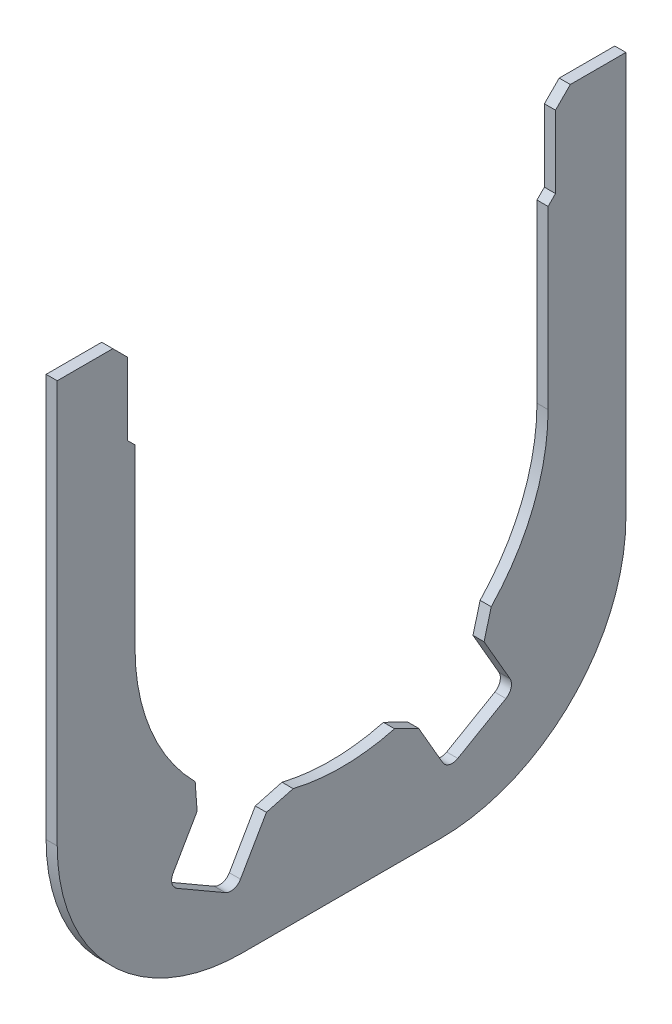
ISO-10303-21;
HEADER;
FILE_DESCRIPTION(('STEP AP214'),'2;1');
FILE_NAME('part.step','',(''),(''),'','','');
FILE_SCHEMA(('AUTOMOTIVE_DESIGN { 1 0 10303 214 1 1 1 1 }'));
ENDSEC;
DATA;
#1=APPLICATION_CONTEXT('core data for automotive mechanical design processes');
#2=APPLICATION_PROTOCOL_DEFINITION('international standard','automotive_design',2000,#1);
#3=PRODUCT_CONTEXT('',#1,'mechanical');
#4=PRODUCT('Part','Part','',(#3));
#5=PRODUCT_RELATED_PRODUCT_CATEGORY('part','',(#4));
#6=PRODUCT_DEFINITION_FORMATION('','',#4);
#7=PRODUCT_DEFINITION_CONTEXT('part definition',#1,'design');
#8=PRODUCT_DEFINITION('design','',#6,#7);
#9=PRODUCT_DEFINITION_SHAPE('','',#8);
#10=(LENGTH_UNIT() NAMED_UNIT(*) SI_UNIT(.MILLI.,.METRE.));
#11=(NAMED_UNIT(*) PLANE_ANGLE_UNIT() SI_UNIT($,.RADIAN.));
#12=(NAMED_UNIT(*) SI_UNIT($,.STERADIAN.) SOLID_ANGLE_UNIT());
#13=UNCERTAINTY_MEASURE_WITH_UNIT(LENGTH_MEASURE(1.E-05),#10,'distance_accuracy_value','');
#14=(GEOMETRIC_REPRESENTATION_CONTEXT(3) GLOBAL_UNCERTAINTY_ASSIGNED_CONTEXT((#13)) GLOBAL_UNIT_ASSIGNED_CONTEXT((#10,
#11,#12)) REPRESENTATION_CONTEXT('',''));
#15=CARTESIAN_POINT('',(0.,0.,0.));
#16=DIRECTION('',(0.,0.,1.));
#17=DIRECTION('',(1.,0.,0.));
#18=AXIS2_PLACEMENT_3D('',#15,#16,#17);
#19=CARTESIAN_POINT('',(-3.,0.,0.));
#20=DIRECTION('',(1.,0.,0.));
#21=DIRECTION('',(0.,0.,-1.));
#22=AXIS2_PLACEMENT_3D('',#19,#20,#21);
#23=CYLINDRICAL_SURFACE('',#22,111.5);
#24=CARTESIAN_POINT('',(3.,0.,0.));
#25=DIRECTION('',(-1.,0.,0.));
#26=DIRECTION('',(0.,0.,-1.));
#27=AXIS2_PLACEMENT_3D('',#24,#25,#26);
#28=CIRCLE('',#27,111.5);
#29=CARTESIAN_POINT('',(3.,-107.766027576746,-28.6135160427385));
#30=VERTEX_POINT('',#29);
#31=CARTESIAN_POINT('',(3.,-108.394468088901,26.1321504611498));
#32=VERTEX_POINT('',#31);
#33=EDGE_CURVE('E468',#30,#32,#28,.T.);
#34=ORIENTED_EDGE('',*,*,#33,.F.);
#35=DIRECTION('',(1.,0.,0.));
#36=VECTOR('',#35,1.);
#37=CARTESIAN_POINT('',(-3.,-107.766027576746,-28.6135160427385));
#38=LINE('',#37,#36);
#39=CARTESIAN_POINT('',(-3.,-107.766027576746,-28.6135160427385));
#40=VERTEX_POINT('',#39);
#41=EDGE_CURVE('E370',#30,#40,#38,.F.);
#42=ORIENTED_EDGE('',*,*,#41,.T.);
#43=CARTESIAN_POINT('',(-3.,0.,0.));
#44=DIRECTION('',(-1.,0.,0.));
#45=DIRECTION('',(0.,0.,-1.));
#46=AXIS2_PLACEMENT_3D('',#43,#44,#45);
#47=CIRCLE('',#46,111.5);
#48=CARTESIAN_POINT('',(-3.,-108.394468088901,26.1321504611498));
#49=VERTEX_POINT('',#48);
#50=EDGE_CURVE('E507',#40,#49,#47,.T.);
#51=ORIENTED_EDGE('',*,*,#50,.T.);
#52=DIRECTION('',(1.,0.,0.));
#53=VECTOR('',#52,1.);
#54=CARTESIAN_POINT('',(-3.,-108.394468088901,26.1321504611497));
#55=LINE('',#54,#53);
#56=EDGE_CURVE('E373',#49,#32,#55,.T.);
#57=ORIENTED_EDGE('',*,*,#56,.T.);
#58=EDGE_LOOP('',(#34,#42,#51,#57));
#59=FACE_BOUND('',#58,.T.);
#60=ADVANCED_FACE('F53',(#59),#23,.F.);
#61=CARTESIAN_POINT('',(-3.,0.,-111.5));
#62=VERTEX_POINT('',#61);
#63=CARTESIAN_POINT('',(-3.,-76.8283401993232,-80.8062877641156));
#64=VERTEX_POINT('',#63);
#65=EDGE_CURVE('E503',#62,#64,#47,.T.);
#66=ORIENTED_EDGE('',*,*,#65,.T.);
#67=DIRECTION('',(1.,0.,0.));
#68=VECTOR('',#67,1.);
#69=CARTESIAN_POINT('',(-3.,-76.8283401993232,-80.8062877641156));
#70=LINE('',#69,#68);
#71=CARTESIAN_POINT('',(3.,-76.8283401993232,-80.8062877641156));
#72=VERTEX_POINT('',#71);
#73=EDGE_CURVE('E366',#64,#72,#70,.T.);
#74=ORIENTED_EDGE('',*,*,#73,.T.);
#75=CARTESIAN_POINT('',(3.,0.,-111.5));
#76=VERTEX_POINT('',#75);
#77=EDGE_CURVE('E464',#76,#72,#28,.T.);
#78=ORIENTED_EDGE('',*,*,#77,.F.);
#79=DIRECTION('',(1.,0.,0.));
#80=VECTOR('',#79,1.);
#81=CARTESIAN_POINT('',(-3.,0.,-111.5));
#82=LINE('',#81,#80);
#83=EDGE_CURVE('E452',#62,#76,#82,.T.);
#84=ORIENTED_EDGE('',*,*,#83,.F.);
#85=EDGE_LOOP('',(#66,#74,#78,#84));
#86=FACE_BOUND('',#85,.T.);
#87=ADVANCED_FACE('F620',(#86),#23,.F.);
#88=CARTESIAN_POINT('',(-3.,146.,111.5));
#89=DIRECTION('',(0.,1.,0.));
#90=DIRECTION('',(0.,0.,1.));
#91=AXIS2_PLACEMENT_3D('',#88,#89,#90);
#92=PLANE('',#91);
#93=DIRECTION('',(0.,0.,1.));
#94=VECTOR('',#93,1.);
#95=CARTESIAN_POINT('',(3.,146.,111.5));
#96=LINE('',#95,#94);
#97=CARTESIAN_POINT('',(3.,146.,123.5));
#98=VERTEX_POINT('',#97);
#99=CARTESIAN_POINT('',(3.,146.,153.5));
#100=VERTEX_POINT('',#99);
#101=EDGE_CURVE('E497',#98,#100,#96,.T.);
#102=ORIENTED_EDGE('',*,*,#101,.F.);
#103=DIRECTION('',(-1.,0.,0.));
#104=VECTOR('',#103,1.);
#105=CARTESIAN_POINT('',(-3.,146.,123.5));
#106=LINE('',#105,#104);
#107=CARTESIAN_POINT('',(-3.,146.,123.5));
#108=VERTEX_POINT('',#107);
#109=EDGE_CURVE('E381',#98,#108,#106,.T.);
#110=ORIENTED_EDGE('',*,*,#109,.T.);
#111=DIRECTION('',(0.,0.,1.));
#112=VECTOR('',#111,1.);
#113=CARTESIAN_POINT('',(-3.,146.,111.5));
#114=LINE('',#113,#112);
#115=CARTESIAN_POINT('',(-3.,146.,153.5));
#116=VERTEX_POINT('',#115);
#117=EDGE_CURVE('E463',#108,#116,#114,.T.);
#118=ORIENTED_EDGE('',*,*,#117,.T.);
#119=DIRECTION('',(1.,0.,0.));
#120=VECTOR('',#119,1.);
#121=CARTESIAN_POINT('',(-3.,146.,153.5));
#122=LINE('',#121,#120);
#123=EDGE_CURVE('E432',#116,#100,#122,.T.);
#124=ORIENTED_EDGE('',*,*,#123,.T.);
#125=EDGE_LOOP('',(#102,#110,#118,#124));
#126=FACE_BOUND('',#125,.T.);
#127=ADVANCED_FACE('F661',(#126),#92,.T.);
#128=CARTESIAN_POINT('',(-3.,0.,111.5));
#129=DIRECTION('',(0.,0.,-1.));
#130=DIRECTION('',(-1.,0.,0.));
#131=AXIS2_PLACEMENT_3D('',#128,#129,#130);
#132=PLANE('',#131);
#133=DIRECTION('',(0.,1.,0.));
#134=VECTOR('',#133,1.);
#135=CARTESIAN_POINT('',(-3.,0.,111.5));
#136=LINE('',#135,#134);
#137=CARTESIAN_POINT('',(-3.,0.,111.5));
#138=VERTEX_POINT('',#137);
#139=CARTESIAN_POINT('',(-3.,95.,111.5));
#140=VERTEX_POINT('',#139);
#141=EDGE_CURVE('E437',#138,#140,#136,.T.);
#142=ORIENTED_EDGE('',*,*,#141,.T.);
#143=DIRECTION('',(1.,0.,0.));
#144=VECTOR('',#143,1.);
#145=CARTESIAN_POINT('',(3.,95.,111.5));
#146=LINE('',#145,#144);
#147=CARTESIAN_POINT('',(3.,95.,111.5));
#148=VERTEX_POINT('',#147);
#149=EDGE_CURVE('E11',#140,#148,#146,.T.);
#150=ORIENTED_EDGE('',*,*,#149,.T.);
#151=DIRECTION('',(0.,1.,0.));
#152=VECTOR('',#151,1.);
#153=CARTESIAN_POINT('',(3.,0.,111.5));
#154=LINE('',#153,#152);
#155=CARTESIAN_POINT('',(3.,0.,111.5));
#156=VERTEX_POINT('',#155);
#157=EDGE_CURVE('E459',#156,#148,#154,.T.);
#158=ORIENTED_EDGE('',*,*,#157,.F.);
#159=DIRECTION('',(1.,0.,0.));
#160=VECTOR('',#159,1.);
#161=CARTESIAN_POINT('',(-3.,0.,111.5));
#162=LINE('',#161,#160);
#163=EDGE_CURVE('E431',#138,#156,#162,.T.);
#164=ORIENTED_EDGE('',*,*,#163,.F.);
#165=EDGE_LOOP('',(#142,#150,#158,#164));
#166=FACE_BOUND('',#165,.T.);
#167=ADVANCED_FACE('F667',(#166),#132,.T.);
#168=CARTESIAN_POINT('',(3.,-78.6630455729779,79.0213595250272));
#169=VERTEX_POINT('',#168);
#170=EDGE_CURVE('E469',#169,#156,#28,.T.);
#171=ORIENTED_EDGE('',*,*,#170,.F.);
#172=DIRECTION('',(1.,0.,0.));
#173=VECTOR('',#172,1.);
#174=CARTESIAN_POINT('',(-3.,-78.6630455729779,79.0213595250272));
#175=LINE('',#174,#173);
#176=CARTESIAN_POINT('',(-3.,-78.6630455729779,79.0213595250272));
#177=VERTEX_POINT('',#176);
#178=EDGE_CURVE('E351',#169,#177,#175,.F.);
#179=ORIENTED_EDGE('',*,*,#178,.T.);
#180=EDGE_CURVE('E508',#177,#138,#47,.T.);
#181=ORIENTED_EDGE('',*,*,#180,.T.);
#182=ORIENTED_EDGE('',*,*,#163,.T.);
#183=EDGE_LOOP('',(#171,#179,#181,#182));
#184=FACE_BOUND('',#183,.T.);
#185=ADVANCED_FACE('F749',(#184),#23,.F.);
#186=CARTESIAN_POINT('',(-3.,0.,-111.5));
#187=DIRECTION('',(0.,0.,1.));
#188=DIRECTION('',(1.,0.,0.));
#189=AXIS2_PLACEMENT_3D('',#186,#187,#188);
#190=PLANE('',#189);
#191=DIRECTION('',(0.,-1.,0.));
#192=VECTOR('',#191,1.);
#193=CARTESIAN_POINT('',(3.,0.,-111.5));
#194=LINE('',#193,#192);
#195=CARTESIAN_POINT('',(3.,95.,-111.5));
#196=VERTEX_POINT('',#195);
#197=EDGE_CURVE('E470',#196,#76,#194,.T.);
#198=ORIENTED_EDGE('',*,*,#197,.F.);
#199=DIRECTION('',(-1.,0.,0.));
#200=VECTOR('',#199,1.);
#201=CARTESIAN_POINT('',(-3.,95.,-111.5));
#202=LINE('',#201,#200);
#203=CARTESIAN_POINT('',(-3.,95.,-111.5));
#204=VERTEX_POINT('',#203);
#205=EDGE_CURVE('E78',#196,#204,#202,.T.);
#206=ORIENTED_EDGE('',*,*,#205,.T.);
#207=DIRECTION('',(0.,-1.,0.));
#208=VECTOR('',#207,1.);
#209=CARTESIAN_POINT('',(-3.,0.,-111.5));
#210=LINE('',#209,#208);
#211=EDGE_CURVE('E509',#204,#62,#210,.T.);
#212=ORIENTED_EDGE('',*,*,#211,.T.);
#213=ORIENTED_EDGE('',*,*,#83,.T.);
#214=EDGE_LOOP('',(#198,#206,#212,#213));
#215=FACE_BOUND('',#214,.T.);
#216=ADVANCED_FACE('F621',(#215),#190,.T.);
#217=CARTESIAN_POINT('',(-3.,146.,-111.5));
#218=DIRECTION('',(0.,1.,0.));
#219=DIRECTION('',(0.,0.,1.));
#220=AXIS2_PLACEMENT_3D('',#217,#218,#219);
#221=PLANE('',#220);
#222=DIRECTION('',(0.,0.,1.));
#223=VECTOR('',#222,1.);
#224=CARTESIAN_POINT('',(-3.,146.,-111.5));
#225=LINE('',#224,#223);
#226=CARTESIAN_POINT('',(-3.,146.,-153.5));
#227=VERTEX_POINT('',#226);
#228=CARTESIAN_POINT('',(-3.,146.,-123.5));
#229=VERTEX_POINT('',#228);
#230=EDGE_CURVE('E512',#227,#229,#225,.T.);
#231=ORIENTED_EDGE('',*,*,#230,.T.);
#232=DIRECTION('',(1.,0.,0.));
#233=VECTOR('',#232,1.);
#234=CARTESIAN_POINT('',(3.,146.,-123.5));
#235=LINE('',#234,#233);
#236=CARTESIAN_POINT('',(3.,146.,-123.5));
#237=VERTEX_POINT('',#236);
#238=EDGE_CURVE('E427',#229,#237,#235,.T.);
#239=ORIENTED_EDGE('',*,*,#238,.T.);
#240=DIRECTION('',(0.,0.,1.));
#241=VECTOR('',#240,1.);
#242=CARTESIAN_POINT('',(3.,146.,-111.5));
#243=LINE('',#242,#241);
#244=CARTESIAN_POINT('',(3.,146.,-153.5));
#245=VERTEX_POINT('',#244);
#246=EDGE_CURVE('E473',#245,#237,#243,.T.);
#247=ORIENTED_EDGE('',*,*,#246,.F.);
#248=DIRECTION('',(1.,0.,0.));
#249=VECTOR('',#248,1.);
#250=CARTESIAN_POINT('',(-3.,146.,-153.5));
#251=LINE('',#250,#249);
#252=EDGE_CURVE('E449',#227,#245,#251,.T.);
#253=ORIENTED_EDGE('',*,*,#252,.F.);
#254=EDGE_LOOP('',(#231,#239,#247,#253));
#255=FACE_BOUND('',#254,.T.);
#256=ADVANCED_FACE('F636',(#255),#221,.T.);
#257=CARTESIAN_POINT('',(-3.,146.,-153.5));
#258=DIRECTION('',(0.,0.,-1.));
#259=DIRECTION('',(0.,1.,0.));
#260=AXIS2_PLACEMENT_3D('',#257,#258,#259);
#261=PLANE('',#260);
#262=DIRECTION('',(0.,1.,0.));
#263=VECTOR('',#262,1.);
#264=CARTESIAN_POINT('',(3.,146.,-153.5));
#265=LINE('',#264,#263);
#266=CARTESIAN_POINT('',(3.,-71.4999999999993,-153.5));
#267=VERTEX_POINT('',#266);
#268=EDGE_CURVE('E477',#267,#245,#265,.T.);
#269=ORIENTED_EDGE('',*,*,#268,.F.);
#270=DIRECTION('',(1.,0.,0.));
#271=VECTOR('',#270,1.);
#272=CARTESIAN_POINT('',(-3.,-71.4999999999993,-153.5));
#273=LINE('',#272,#271);
#274=CARTESIAN_POINT('',(-3.,-71.4999999999993,-153.5));
#275=VERTEX_POINT('',#274);
#276=EDGE_CURVE('E446',#275,#267,#273,.T.);
#277=ORIENTED_EDGE('',*,*,#276,.F.);
#278=DIRECTION('',(0.,1.,0.));
#279=VECTOR('',#278,1.);
#280=CARTESIAN_POINT('',(-3.,146.,-153.5));
#281=LINE('',#280,#279);
#282=EDGE_CURVE('E516',#275,#227,#281,.T.);
#283=ORIENTED_EDGE('',*,*,#282,.T.);
#284=ORIENTED_EDGE('',*,*,#252,.T.);
#285=EDGE_LOOP('',(#269,#277,#283,#284));
#286=FACE_BOUND('',#285,.T.);
#287=ADVANCED_FACE('F642',(#286),#261,.T.);
#288=CARTESIAN_POINT('',(-3.,-71.5,-53.5));
#289=DIRECTION('',(1.,0.,0.));
#290=DIRECTION('',(0.,0.,-1.));
#291=AXIS2_PLACEMENT_3D('',#288,#289,#290);
#292=CYLINDRICAL_SURFACE('',#291,100.);
#293=CARTESIAN_POINT('',(3.,-71.5,-53.5));
#294=DIRECTION('',(1.,0.,0.));
#295=DIRECTION('',(0.,0.,-1.));
#296=AXIS2_PLACEMENT_3D('',#293,#294,#295);
#297=CIRCLE('',#296,100.);
#298=CARTESIAN_POINT('',(3.,-171.5,-53.4999999999993));
#299=VERTEX_POINT('',#298);
#300=EDGE_CURVE('E481',#299,#267,#297,.T.);
#301=ORIENTED_EDGE('',*,*,#300,.F.);
#302=DIRECTION('',(1.,0.,0.));
#303=VECTOR('',#302,1.);
#304=CARTESIAN_POINT('',(-3.,-171.5,-53.4999999999993));
#305=LINE('',#304,#303);
#306=CARTESIAN_POINT('',(-3.,-171.5,-53.4999999999993));
#307=VERTEX_POINT('',#306);
#308=EDGE_CURVE('E443',#307,#299,#305,.T.);
#309=ORIENTED_EDGE('',*,*,#308,.F.);
#310=CARTESIAN_POINT('',(-3.,-71.5,-53.5));
#311=DIRECTION('',(1.,0.,0.));
#312=DIRECTION('',(0.,0.,-1.));
#313=AXIS2_PLACEMENT_3D('',#310,#311,#312);
#314=CIRCLE('',#313,100.);
#315=EDGE_CURVE('E520',#307,#275,#314,.T.);
#316=ORIENTED_EDGE('',*,*,#315,.T.);
#317=ORIENTED_EDGE('',*,*,#276,.T.);
#318=EDGE_LOOP('',(#301,#309,#316,#317));
#319=FACE_BOUND('',#318,.T.);
#320=ADVANCED_FACE('F645',(#319),#292,.T.);
#321=CARTESIAN_POINT('',(-3.,-171.5,53.4999999999993));
#322=DIRECTION('',(0.,-1.,0.));
#323=DIRECTION('',(0.,0.,-1.));
#324=AXIS2_PLACEMENT_3D('',#321,#322,#323);
#325=PLANE('',#324);
#326=DIRECTION('',(0.,0.,-1.));
#327=VECTOR('',#326,1.);
#328=CARTESIAN_POINT('',(3.,-171.5,53.4999999999993));
#329=LINE('',#328,#327);
#330=CARTESIAN_POINT('',(3.,-171.5,53.4999999999993));
#331=VERTEX_POINT('',#330);
#332=EDGE_CURVE('E485',#331,#299,#329,.T.);
#333=ORIENTED_EDGE('',*,*,#332,.F.);
#334=DIRECTION('',(1.,0.,0.));
#335=VECTOR('',#334,1.);
#336=CARTESIAN_POINT('',(-3.,-171.5,53.4999999999993));
#337=LINE('',#336,#335);
#338=CARTESIAN_POINT('',(-3.,-171.5,53.4999999999993));
#339=VERTEX_POINT('',#338);
#340=EDGE_CURVE('E440',#339,#331,#337,.T.);
#341=ORIENTED_EDGE('',*,*,#340,.F.);
#342=DIRECTION('',(0.,0.,-1.));
#343=VECTOR('',#342,1.);
#344=CARTESIAN_POINT('',(-3.,-171.5,53.4999999999993));
#345=LINE('',#344,#343);
#346=EDGE_CURVE('E524',#339,#307,#345,.T.);
#347=ORIENTED_EDGE('',*,*,#346,.T.);
#348=ORIENTED_EDGE('',*,*,#308,.T.);
#349=EDGE_LOOP('',(#333,#341,#347,#348));
#350=FACE_BOUND('',#349,.T.);
#351=ADVANCED_FACE('F650',(#350),#325,.T.);
#352=CARTESIAN_POINT('',(-3.,-71.5,53.5));
#353=DIRECTION('',(1.,0.,0.));
#354=DIRECTION('',(0.,0.,-1.));
#355=AXIS2_PLACEMENT_3D('',#352,#353,#354);
#356=CYLINDRICAL_SURFACE('',#355,100.);
#357=CARTESIAN_POINT('',(3.,-71.5,53.5));
#358=DIRECTION('',(1.,0.,0.));
#359=DIRECTION('',(0.,0.,-1.));
#360=AXIS2_PLACEMENT_3D('',#357,#358,#359);
#361=CIRCLE('',#360,100.);
#362=CARTESIAN_POINT('',(3.,-71.4999999999993,153.5));
#363=VERTEX_POINT('',#362);
#364=EDGE_CURVE('E489',#363,#331,#361,.T.);
#365=ORIENTED_EDGE('',*,*,#364,.F.);
#366=DIRECTION('',(1.,0.,0.));
#367=VECTOR('',#366,1.);
#368=CARTESIAN_POINT('',(-3.,-71.4999999999993,153.5));
#369=LINE('',#368,#367);
#370=CARTESIAN_POINT('',(-3.,-71.4999999999993,153.5));
#371=VERTEX_POINT('',#370);
#372=EDGE_CURVE('E436',#371,#363,#369,.T.);
#373=ORIENTED_EDGE('',*,*,#372,.F.);
#374=CARTESIAN_POINT('',(-3.,-71.5,53.5));
#375=DIRECTION('',(1.,0.,0.));
#376=DIRECTION('',(0.,0.,-1.));
#377=AXIS2_PLACEMENT_3D('',#374,#375,#376);
#378=CIRCLE('',#377,100.);
#379=EDGE_CURVE('E528',#371,#339,#378,.T.);
#380=ORIENTED_EDGE('',*,*,#379,.T.);
#381=ORIENTED_EDGE('',*,*,#340,.T.);
#382=EDGE_LOOP('',(#365,#373,#380,#381));
#383=FACE_BOUND('',#382,.T.);
#384=ADVANCED_FACE('F653',(#383),#356,.T.);
#385=CARTESIAN_POINT('',(-3.,146.,153.5));
#386=DIRECTION('',(0.,0.,1.));
#387=DIRECTION('',(0.,-1.,0.));
#388=AXIS2_PLACEMENT_3D('',#385,#386,#387);
#389=PLANE('',#388);
#390=DIRECTION('',(0.,-1.,0.));
#391=VECTOR('',#390,1.);
#392=CARTESIAN_POINT('',(3.,146.,153.5));
#393=LINE('',#392,#391);
#394=EDGE_CURVE('E493',#100,#363,#393,.T.);
#395=ORIENTED_EDGE('',*,*,#394,.F.);
#396=ORIENTED_EDGE('',*,*,#123,.F.);
#397=DIRECTION('',(0.,-1.,0.));
#398=VECTOR('',#397,1.);
#399=CARTESIAN_POINT('',(-3.,146.,153.5));
#400=LINE('',#399,#398);
#401=EDGE_CURVE('E532',#116,#371,#400,.T.);
#402=ORIENTED_EDGE('',*,*,#401,.T.);
#403=ORIENTED_EDGE('',*,*,#372,.T.);
#404=EDGE_LOOP('',(#395,#396,#402,#403));
#405=FACE_BOUND('',#404,.T.);
#406=ADVANCED_FACE('F658',(#405),#389,.T.);
#407=CARTESIAN_POINT('',(-3.,-71.5,53.5));
#408=DIRECTION('',(1.,0.,0.));
#409=DIRECTION('',(0.,0.,-1.));
#410=AXIS2_PLACEMENT_3D('',#407,#408,#409);
#411=PLANE('',#410);
#412=ORIENTED_EDGE('',*,*,#211,.F.);
#413=DIRECTION('',(0.,0.707106781186548,-0.707106781186548));
#414=VECTOR('',#413,1.);
#415=CARTESIAN_POINT('',(-3.,99.,-115.5));
#416=LINE('',#415,#414);
#417=CARTESIAN_POINT('',(-3.,99.,-115.5));
#418=VERTEX_POINT('',#417);
#419=EDGE_CURVE('E63',#204,#418,#416,.T.);
#420=ORIENTED_EDGE('',*,*,#419,.T.);
#421=DIRECTION('',(0.,1.,0.));
#422=VECTOR('',#421,1.);
#423=CARTESIAN_POINT('',(-3.,146.,-115.5));
#424=LINE('',#423,#422);
#425=CARTESIAN_POINT('',(-3.,138.,-115.5));
#426=VERTEX_POINT('',#425);
#427=EDGE_CURVE('E563',#418,#426,#424,.T.);
#428=ORIENTED_EDGE('',*,*,#427,.T.);
#429=DIRECTION('',(0.,0.70710678118655,-0.707106781186545));
#430=VECTOR('',#429,1.);
#431=CARTESIAN_POINT('',(-3.,146.,-123.5));
#432=LINE('',#431,#430);
#433=EDGE_CURVE('E387',#426,#229,#432,.T.);
#434=ORIENTED_EDGE('',*,*,#433,.T.);
#435=ORIENTED_EDGE('',*,*,#230,.F.);
#436=ORIENTED_EDGE('',*,*,#282,.F.);
#437=ORIENTED_EDGE('',*,*,#315,.F.);
#438=ORIENTED_EDGE('',*,*,#346,.F.);
#439=ORIENTED_EDGE('',*,*,#379,.F.);
#440=ORIENTED_EDGE('',*,*,#401,.F.);
#441=ORIENTED_EDGE('',*,*,#117,.F.);
#442=DIRECTION('',(0.,-0.707106781186545,-0.70710678118655));
#443=VECTOR('',#442,1.);
#444=CARTESIAN_POINT('',(-3.,138.,115.5));
#445=LINE('',#444,#443);
#446=CARTESIAN_POINT('',(-3.,138.,115.5));
#447=VERTEX_POINT('',#446);
#448=EDGE_CURVE('E269',#108,#447,#445,.T.);
#449=ORIENTED_EDGE('',*,*,#448,.T.);
#450=DIRECTION('',(0.,-1.,0.));
#451=VECTOR('',#450,1.);
#452=CARTESIAN_POINT('',(-3.,146.,115.5));
#453=LINE('',#452,#451);
#454=CARTESIAN_POINT('',(-3.,99.,115.5));
#455=VERTEX_POINT('',#454);
#456=EDGE_CURVE('E264',#447,#455,#453,.T.);
#457=ORIENTED_EDGE('',*,*,#456,.T.);
#458=DIRECTION('',(0.,-0.707106781186548,-0.707106781186548));
#459=VECTOR('',#458,1.);
#460=CARTESIAN_POINT('',(-3.,95.,111.5));
#461=LINE('',#460,#459);
#462=EDGE_CURVE('E70',#455,#140,#461,.T.);
#463=ORIENTED_EDGE('',*,*,#462,.T.);
#464=ORIENTED_EDGE('',*,*,#141,.F.);
#465=ORIENTED_EDGE('',*,*,#180,.F.);
#466=DIRECTION('',(0.,0.99738554667317,0.0722639003061803));
#467=VECTOR('',#466,1.);
#468=CARTESIAN_POINT('',(-3.,-93.0620389755904,77.978104559857));
#469=LINE('',#468,#467);
#470=CARTESIAN_POINT('',(-3.,-93.0620389755904,77.978104559857));
#471=VERTEX_POINT('',#470);
#472=EDGE_CURVE('E401',#177,#471,#469,.F.);
#473=ORIENTED_EDGE('',*,*,#472,.T.);
#474=DIRECTION('',(0.,-0.866025403784438,0.5));
#475=VECTOR('',#474,1.);
#476=CARTESIAN_POINT('',(-3.,-84.3337360858465,72.9388165368948));
#477=LINE('',#476,#475);
#478=CARTESIAN_POINT('',(-3.,-115.510650622086,90.9388165368948));
#479=VERTEX_POINT('',#478);
#480=EDGE_CURVE('E544',#471,#479,#477,.T.);
#481=ORIENTED_EDGE('',*,*,#480,.T.);
#482=CARTESIAN_POINT('',(-3.,-118.510650622086,85.7426641141882));
#483=DIRECTION('',(1.,0.,0.));
#484=DIRECTION('',(0.,0.,-1.));
#485=AXIS2_PLACEMENT_3D('',#482,#483,#484);
#486=CIRCLE('',#485,6.);
#487=CARTESIAN_POINT('',(-3.,-123.706803044793,88.7426641141882));
#488=VERTEX_POINT('',#487);
#489=EDGE_CURVE('E299',#479,#488,#486,.T.);
#490=ORIENTED_EDGE('',*,*,#489,.T.);
#491=DIRECTION('',(0.,-0.500000000000001,-0.866025403784438));
#492=VECTOR('',#491,1.);
#493=CARTESIAN_POINT('',(-3.,-120.706803044793,93.9388165368948));
#494=LINE('',#493,#492);
#495=CARTESIAN_POINT('',(-3.,-138.706803044793,62.761902000655));
#496=VERTEX_POINT('',#495);
#497=EDGE_CURVE('E540',#488,#496,#494,.T.);
#498=ORIENTED_EDGE('',*,*,#497,.T.);
#499=CARTESIAN_POINT('',(-3.,-133.510650622086,59.761902000655));
#500=DIRECTION('',(1.,0.,0.));
#501=DIRECTION('',(0.,0.,-1.));
#502=AXIS2_PLACEMENT_3D('',#499,#500,#501);
#503=CIRCLE('',#502,6.);
#504=CARTESIAN_POINT('',(-3.,-136.510650622086,54.5657495779484));
#505=VERTEX_POINT('',#504);
#506=EDGE_CURVE('E305',#496,#505,#503,.T.);
#507=ORIENTED_EDGE('',*,*,#506,.T.);
#508=DIRECTION('',(0.,0.866025403784438,-0.5));
#509=VECTOR('',#508,1.);
#510=CARTESIAN_POINT('',(-3.,-141.706803044793,57.5657495779484));
#511=LINE('',#510,#509);
#512=CARTESIAN_POINT('',(-3.,-112.261939316122,40.5657495779484));
#513=VERTEX_POINT('',#512);
#514=EDGE_CURVE('E500',#505,#513,#511,.T.);
#515=ORIENTED_EDGE('',*,*,#514,.T.);
#516=DIRECTION('',(0.,-0.258819045102521,0.965925826289068));
#517=VECTOR('',#516,1.);
#518=CARTESIAN_POINT('',(-3.,-108.394468088901,26.1321504611497));
#519=LINE('',#518,#517);
#520=EDGE_CURVE('E398',#513,#49,#519,.F.);
#521=ORIENTED_EDGE('',*,*,#520,.T.);
#522=ORIENTED_EDGE('',*,*,#50,.F.);
#523=DIRECTION('',(0.,0.436110399894887,0.899893170939486));
#524=VECTOR('',#523,1.);
#525=CARTESIAN_POINT('',(-3.,-114.062038975591,-41.6050376009107));
#526=LINE('',#525,#524);
#527=CARTESIAN_POINT('',(-3.,-114.062038975591,-41.6050376009107));
#528=VERTEX_POINT('',#527);
#529=EDGE_CURVE('E392',#40,#528,#526,.F.);
#530=ORIENTED_EDGE('',*,*,#529,.T.);
#531=DIRECTION('',(0.,-0.866025403784438,-0.5));
#532=VECTOR('',#531,1.);
#533=CARTESIAN_POINT('',(-3.,-105.333736085847,-36.5657495779484));
#534=LINE('',#533,#532);
#535=CARTESIAN_POINT('',(-3.,-136.510650622086,-54.5657495779484));
#536=VERTEX_POINT('',#535);
#537=EDGE_CURVE('E587',#528,#536,#534,.T.);
#538=ORIENTED_EDGE('',*,*,#537,.T.);
#539=CARTESIAN_POINT('',(-3.,-133.510650622086,-59.761902000655));
#540=DIRECTION('',(1.,0.,0.));
#541=DIRECTION('',(0.,0.,-1.));
#542=AXIS2_PLACEMENT_3D('',#539,#540,#541);
#543=CIRCLE('',#542,6.);
#544=CARTESIAN_POINT('',(-3.,-138.706803044793,-62.761902000655));
#545=VERTEX_POINT('',#544);
#546=EDGE_CURVE('E317',#536,#545,#543,.T.);
#547=ORIENTED_EDGE('',*,*,#546,.T.);
#548=DIRECTION('',(0.,0.500000000000001,-0.866025403784438));
#549=VECTOR('',#548,1.);
#550=CARTESIAN_POINT('',(-3.,-141.706803044793,-57.5657495779484));
#551=LINE('',#550,#549);
#552=CARTESIAN_POINT('',(-3.,-123.706803044793,-88.7426641141882));
#553=VERTEX_POINT('',#552);
#554=EDGE_CURVE('E572',#545,#553,#551,.T.);
#555=ORIENTED_EDGE('',*,*,#554,.T.);
#556=CARTESIAN_POINT('',(-3.,-118.510650622086,-85.7426641141882));
#557=DIRECTION('',(1.,0.,0.));
#558=DIRECTION('',(0.,0.,-1.));
#559=AXIS2_PLACEMENT_3D('',#556,#557,#558);
#560=CIRCLE('',#559,6.);
#561=CARTESIAN_POINT('',(-3.,-115.510650622086,-90.9388165368948));
#562=VERTEX_POINT('',#561);
#563=EDGE_CURVE('E311',#553,#562,#560,.T.);
#564=ORIENTED_EDGE('',*,*,#563,.T.);
#565=DIRECTION('',(0.,0.866025403784438,0.500000000000001));
#566=VECTOR('',#565,1.);
#567=CARTESIAN_POINT('',(-3.,-120.706803044793,-93.9388165368948));
#568=LINE('',#567,#566);
#569=CARTESIAN_POINT('',(-3.,-91.2619393161221,-76.9388165368948));
#570=VERTEX_POINT('',#569);
#571=EDGE_CURVE('E584',#562,#570,#568,.T.);
#572=ORIENTED_EDGE('',*,*,#571,.T.);
#573=DIRECTION('',(0.,-0.965925826289069,0.258819045102518));
#574=VECTOR('',#573,1.);
#575=CARTESIAN_POINT('',(-3.,-76.8283401993232,-80.8062877641156));
#576=LINE('',#575,#574);
#577=EDGE_CURVE('E395',#570,#64,#576,.F.);
#578=ORIENTED_EDGE('',*,*,#577,.T.);
#579=ORIENTED_EDGE('',*,*,#65,.F.);
#580=EDGE_LOOP('',(#412,#420,#428,#434,#435,#436,#437,#438,#439,#440,#441,#449,#457,#463,#464,
#465,#473,#481,#490,#498,#507,#515,#521,#522,#530,#538,#547,#555,#564,#572,#578,#579));
#581=FACE_BOUND('',#580,.T.);
#582=ADVANCED_FACE('F266',(#581),#411,.F.);
#583=CARTESIAN_POINT('',(3.,-71.5,53.5));
#584=DIRECTION('',(1.,0.,0.));
#585=DIRECTION('',(0.,0.,-1.));
#586=AXIS2_PLACEMENT_3D('',#583,#584,#585);
#587=PLANE('',#586);
#588=DIRECTION('',(0.,1.,0.));
#589=VECTOR('',#588,1.);
#590=CARTESIAN_POINT('',(3.,146.,-115.5));
#591=LINE('',#590,#589);
#592=CARTESIAN_POINT('',(3.,99.,-115.5));
#593=VERTEX_POINT('',#592);
#594=CARTESIAN_POINT('',(3.,138.,-115.5));
#595=VERTEX_POINT('',#594);
#596=EDGE_CURVE('E283',#593,#595,#591,.T.);
#597=ORIENTED_EDGE('',*,*,#596,.F.);
#598=DIRECTION('',(0.,-0.707106781186548,0.707106781186548));
#599=VECTOR('',#598,1.);
#600=CARTESIAN_POINT('',(3.,-70.75,54.25));
#601=LINE('',#600,#599);
#602=EDGE_CURVE('E291',#593,#196,#601,.T.);
#603=ORIENTED_EDGE('',*,*,#602,.T.);
#604=ORIENTED_EDGE('',*,*,#197,.T.);
#605=ORIENTED_EDGE('',*,*,#77,.T.);
#606=DIRECTION('',(0.,0.965925826289069,-0.258819045102518));
#607=VECTOR('',#606,1.);
#608=CARTESIAN_POINT('',(3.,-105.43350305438,-73.1415574777424));
#609=LINE('',#608,#607);
#610=CARTESIAN_POINT('',(3.,-91.2619393161221,-76.9388165368948));
#611=VERTEX_POINT('',#610);
#612=EDGE_CURVE('E416',#72,#611,#609,.F.);
#613=ORIENTED_EDGE('',*,*,#612,.T.);
#614=DIRECTION('',(0.,0.866025403784438,0.500000000000001));
#615=VECTOR('',#614,1.);
#616=CARTESIAN_POINT('',(3.,-120.706803044793,-93.9388165368948));
#617=LINE('',#616,#615);
#618=CARTESIAN_POINT('',(3.,-115.510650622086,-90.9388165368948));
#619=VERTEX_POINT('',#618);
#620=EDGE_CURVE('E559',#619,#611,#617,.T.);
#621=ORIENTED_EDGE('',*,*,#620,.F.);
#622=CARTESIAN_POINT('',(3.,-118.510650622086,-85.7426641141882));
#623=DIRECTION('',(1.,0.,0.));
#624=DIRECTION('',(0.,0.,-1.));
#625=AXIS2_PLACEMENT_3D('',#622,#623,#624);
#626=CIRCLE('',#625,6.);
#627=CARTESIAN_POINT('',(3.,-123.706803044793,-88.7426641141882));
#628=VERTEX_POINT('',#627);
#629=EDGE_CURVE('E314',#619,#628,#626,.F.);
#630=ORIENTED_EDGE('',*,*,#629,.T.);
#631=DIRECTION('',(0.,0.500000000000001,-0.866025403784438));
#632=VECTOR('',#631,1.);
#633=CARTESIAN_POINT('',(3.,-141.706803044793,-57.5657495779484));
#634=LINE('',#633,#632);
#635=CARTESIAN_POINT('',(3.,-138.706803044793,-62.761902000655));
#636=VERTEX_POINT('',#635);
#637=EDGE_CURVE('E580',#636,#628,#634,.T.);
#638=ORIENTED_EDGE('',*,*,#637,.F.);
#639=CARTESIAN_POINT('',(3.,-133.510650622086,-59.761902000655));
#640=DIRECTION('',(1.,0.,0.));
#641=DIRECTION('',(0.,0.,-1.));
#642=AXIS2_PLACEMENT_3D('',#639,#640,#641);
#643=CIRCLE('',#642,6.);
#644=CARTESIAN_POINT('',(3.,-136.510650622086,-54.5657495779484));
#645=VERTEX_POINT('',#644);
#646=EDGE_CURVE('E320',#636,#645,#643,.F.);
#647=ORIENTED_EDGE('',*,*,#646,.T.);
#648=DIRECTION('',(0.,-0.866025403784438,-0.5));
#649=VECTOR('',#648,1.);
#650=CARTESIAN_POINT('',(3.,-105.333736085847,-36.5657495779484));
#651=LINE('',#650,#649);
#652=CARTESIAN_POINT('',(3.,-114.062038975591,-41.6050376009107));
#653=VERTEX_POINT('',#652);
#654=EDGE_CURVE('E576',#653,#645,#651,.T.);
#655=ORIENTED_EDGE('',*,*,#654,.F.);
#656=DIRECTION('',(0.,-0.436110399894887,-0.899893170939486));
#657=VECTOR('',#656,1.);
#658=CARTESIAN_POINT('',(3.,-68.6428321948151,52.1153460940423));
#659=LINE('',#658,#657);
#660=EDGE_CURVE('E413',#653,#30,#659,.F.);
#661=ORIENTED_EDGE('',*,*,#660,.T.);
#662=ORIENTED_EDGE('',*,*,#33,.T.);
#663=DIRECTION('',(0.,0.258819045102521,-0.965925826289068));
#664=VECTOR('',#663,1.);
#665=CARTESIAN_POINT('',(3.,-112.764969741215,42.4430846821469));
#666=LINE('',#665,#664);
#667=CARTESIAN_POINT('',(3.,-112.261939316122,40.5657495779484));
#668=VERTEX_POINT('',#667);
#669=EDGE_CURVE('E420',#32,#668,#666,.F.);
#670=ORIENTED_EDGE('',*,*,#669,.T.);
#671=DIRECTION('',(0.,0.866025403784438,-0.5));
#672=VECTOR('',#671,1.);
#673=CARTESIAN_POINT('',(3.,-141.706803044793,57.5657495779484));
#674=LINE('',#673,#672);
#675=CARTESIAN_POINT('',(3.,-136.510650622086,54.5657495779484));
#676=VERTEX_POINT('',#675);
#677=EDGE_CURVE('E548',#676,#668,#674,.T.);
#678=ORIENTED_EDGE('',*,*,#677,.F.);
#679=CARTESIAN_POINT('',(3.,-133.510650622086,59.761902000655));
#680=DIRECTION('',(1.,0.,0.));
#681=DIRECTION('',(0.,0.,-1.));
#682=AXIS2_PLACEMENT_3D('',#679,#680,#681);
#683=CIRCLE('',#682,6.);
#684=CARTESIAN_POINT('',(3.,-138.706803044793,62.761902000655));
#685=VERTEX_POINT('',#684);
#686=EDGE_CURVE('E308',#676,#685,#683,.F.);
#687=ORIENTED_EDGE('',*,*,#686,.T.);
#688=DIRECTION('',(0.,-0.500000000000001,-0.866025403784438));
#689=VECTOR('',#688,1.);
#690=CARTESIAN_POINT('',(3.,-120.706803044793,93.9388165368948));
#691=LINE('',#690,#689);
#692=CARTESIAN_POINT('',(3.,-123.706803044793,88.7426641141882));
#693=VERTEX_POINT('',#692);
#694=EDGE_CURVE('E551',#693,#685,#691,.T.);
#695=ORIENTED_EDGE('',*,*,#694,.F.);
#696=CARTESIAN_POINT('',(3.,-118.510650622086,85.7426641141882));
#697=DIRECTION('',(1.,0.,0.));
#698=DIRECTION('',(0.,0.,-1.));
#699=AXIS2_PLACEMENT_3D('',#696,#697,#698);
#700=CIRCLE('',#699,6.);
#701=CARTESIAN_POINT('',(3.,-115.510650622086,90.9388165368948));
#702=VERTEX_POINT('',#701);
#703=EDGE_CURVE('E302',#693,#702,#700,.F.);
#704=ORIENTED_EDGE('',*,*,#703,.T.);
#705=DIRECTION('',(0.,-0.866025403784438,0.5));
#706=VECTOR('',#705,1.);
#707=CARTESIAN_POINT('',(3.,-84.3337360858465,72.9388165368948));
#708=LINE('',#707,#706);
#709=CARTESIAN_POINT('',(3.,-93.0620389755904,77.978104559857));
#710=VERTEX_POINT('',#709);
#711=EDGE_CURVE('E555',#710,#702,#708,.T.);
#712=ORIENTED_EDGE('',*,*,#711,.F.);
#713=DIRECTION('',(0.,-0.99738554667317,-0.0722639003061803));
#714=VECTOR('',#713,1.);
#715=CARTESIAN_POINT('',(3.,-73.3768571493831,79.4043614589499));
#716=LINE('',#715,#714);
#717=EDGE_CURVE('E424',#710,#169,#716,.F.);
#718=ORIENTED_EDGE('',*,*,#717,.T.);
#719=ORIENTED_EDGE('',*,*,#170,.T.);
#720=ORIENTED_EDGE('',*,*,#157,.T.);
#721=DIRECTION('',(0.,0.707106781186548,0.707106781186548));
#722=VECTOR('',#721,1.);
#723=CARTESIAN_POINT('',(3.,-17.25,-0.750000000000015));
#724=LINE('',#723,#722);
#725=CARTESIAN_POINT('',(3.,99.,115.5));
#726=VERTEX_POINT('',#725);
#727=EDGE_CURVE('E296',#148,#726,#724,.T.);
#728=ORIENTED_EDGE('',*,*,#727,.T.);
#729=DIRECTION('',(0.,-1.,0.));
#730=VECTOR('',#729,1.);
#731=CARTESIAN_POINT('',(3.,146.,115.5));
#732=LINE('',#731,#730);
#733=CARTESIAN_POINT('',(3.,138.,115.5));
#734=VERTEX_POINT('',#733);
#735=EDGE_CURVE('E274',#734,#726,#732,.T.);
#736=ORIENTED_EDGE('',*,*,#735,.F.);
#737=DIRECTION('',(0.,0.707106781186545,0.70710678118655));
#738=VECTOR('',#737,1.);
#739=CARTESIAN_POINT('',(3.,2.25000000000064,-20.2500000000002));
#740=LINE('',#739,#738);
#741=EDGE_CURVE('E410',#734,#98,#740,.T.);
#742=ORIENTED_EDGE('',*,*,#741,.T.);
#743=ORIENTED_EDGE('',*,*,#101,.T.);
#744=ORIENTED_EDGE('',*,*,#394,.T.);
#745=ORIENTED_EDGE('',*,*,#364,.T.);
#746=ORIENTED_EDGE('',*,*,#332,.T.);
#747=ORIENTED_EDGE('',*,*,#300,.T.);
#748=ORIENTED_EDGE('',*,*,#268,.T.);
#749=ORIENTED_EDGE('',*,*,#246,.T.);
#750=DIRECTION('',(0.,-0.70710678118655,0.707106781186545));
#751=VECTOR('',#750,1.);
#752=CARTESIAN_POINT('',(3.,-51.2500000000008,73.7499999999994));
#753=LINE('',#752,#751);
#754=EDGE_CURVE('E407',#237,#595,#753,.T.);
#755=ORIENTED_EDGE('',*,*,#754,.T.);
#756=EDGE_LOOP('',(#597,#603,#604,#605,#613,#621,#630,#638,#647,#655,#661,#662,#670,#678,#687,
#695,#704,#712,#718,#719,#720,#728,#736,#742,#743,#744,#745,#746,#747,#748,#749,#755));
#757=FACE_BOUND('',#756,.T.);
#758=ADVANCED_FACE('F609',(#757),#587,.T.);
#759=CARTESIAN_POINT('',(-3.,-141.706803044793,57.5657495779484));
#760=DIRECTION('',(0.,-0.5,-0.866025403784439));
#761=DIRECTION('',(0.,0.866025403784439,-0.5));
#762=AXIS2_PLACEMENT_3D('',#759,#760,#761);
#763=PLANE('',#762);
#764=ORIENTED_EDGE('',*,*,#514,.F.);
#765=DIRECTION('',(1.,0.,0.));
#766=VECTOR('',#765,1.);
#767=CARTESIAN_POINT('',(3.,-136.510650622086,54.5657495779484));
#768=LINE('',#767,#766);
#769=EDGE_CURVE('E333',#505,#676,#768,.T.);
#770=ORIENTED_EDGE('',*,*,#769,.T.);
#771=ORIENTED_EDGE('',*,*,#677,.T.);
#772=DIRECTION('',(-1.,0.,0.));
#773=VECTOR('',#772,1.);
#774=CARTESIAN_POINT('',(-3.,-112.261939316122,40.5657495779484));
#775=LINE('',#774,#773);
#776=EDGE_CURVE('E358',#668,#513,#775,.T.);
#777=ORIENTED_EDGE('',*,*,#776,.T.);
#778=EDGE_LOOP('',(#764,#770,#771,#777));
#779=FACE_BOUND('',#778,.T.);
#780=ADVANCED_FACE('F699',(#779),#763,.F.);
#781=CARTESIAN_POINT('',(-3.,-120.706803044793,93.9388165368948));
#782=DIRECTION('',(0.,-0.866025403784438,0.500000000000001));
#783=DIRECTION('',(0.,-0.500000000000001,-0.866025403784438));
#784=AXIS2_PLACEMENT_3D('',#781,#782,#783);
#785=PLANE('',#784);
#786=ORIENTED_EDGE('',*,*,#694,.T.);
#787=DIRECTION('',(1.,0.,0.));
#788=VECTOR('',#787,1.);
#789=CARTESIAN_POINT('',(-3.,-138.706803044793,62.761902000655));
#790=LINE('',#789,#788);
#791=EDGE_CURVE('E326',#685,#496,#790,.F.);
#792=ORIENTED_EDGE('',*,*,#791,.T.);
#793=ORIENTED_EDGE('',*,*,#497,.F.);
#794=DIRECTION('',(1.,0.,0.));
#795=VECTOR('',#794,1.);
#796=CARTESIAN_POINT('',(3.,-123.706803044793,88.7426641141882));
#797=LINE('',#796,#795);
#798=EDGE_CURVE('E329',#488,#693,#797,.T.);
#799=ORIENTED_EDGE('',*,*,#798,.T.);
#800=EDGE_LOOP('',(#786,#792,#793,#799));
#801=FACE_BOUND('',#800,.T.);
#802=ADVANCED_FACE('F690',(#801),#785,.F.);
#803=CARTESIAN_POINT('',(-3.,-84.3337360858465,72.9388165368948));
#804=DIRECTION('',(0.,0.5,0.866025403784438));
#805=DIRECTION('',(0.,-0.866025403784438,0.5));
#806=AXIS2_PLACEMENT_3D('',#803,#804,#805);
#807=PLANE('',#806);
#808=ORIENTED_EDGE('',*,*,#711,.T.);
#809=DIRECTION('',(1.,0.,0.));
#810=VECTOR('',#809,1.);
#811=CARTESIAN_POINT('',(-3.,-115.510650622086,90.9388165368948));
#812=LINE('',#811,#810);
#813=EDGE_CURVE('E323',#702,#479,#812,.F.);
#814=ORIENTED_EDGE('',*,*,#813,.T.);
#815=ORIENTED_EDGE('',*,*,#480,.F.);
#816=DIRECTION('',(1.,0.,0.));
#817=VECTOR('',#816,1.);
#818=CARTESIAN_POINT('',(3.,-93.0620389755904,77.978104559857));
#819=LINE('',#818,#817);
#820=EDGE_CURVE('E354',#471,#710,#819,.T.);
#821=ORIENTED_EDGE('',*,*,#820,.T.);
#822=EDGE_LOOP('',(#808,#814,#815,#821));
#823=FACE_BOUND('',#822,.T.);
#824=ADVANCED_FACE('F680',(#823),#807,.F.);
#825=CARTESIAN_POINT('',(-3.,-120.706803044793,-93.9388165368948));
#826=DIRECTION('',(0.,0.500000000000001,-0.866025403784438));
#827=DIRECTION('',(0.,0.866025403784438,0.500000000000001));
#828=AXIS2_PLACEMENT_3D('',#825,#826,#827);
#829=PLANE('',#828);
#830=ORIENTED_EDGE('',*,*,#571,.F.);
#831=DIRECTION('',(1.,0.,0.));
#832=VECTOR('',#831,1.);
#833=CARTESIAN_POINT('',(3.,-115.510650622086,-90.9388165368948));
#834=LINE('',#833,#832);
#835=EDGE_CURVE('E337',#562,#619,#834,.T.);
#836=ORIENTED_EDGE('',*,*,#835,.T.);
#837=ORIENTED_EDGE('',*,*,#620,.T.);
#838=DIRECTION('',(-1.,0.,0.));
#839=VECTOR('',#838,1.);
#840=CARTESIAN_POINT('',(-3.,-91.2619393161221,-76.9388165368948));
#841=LINE('',#840,#839);
#842=EDGE_CURVE('E362',#611,#570,#841,.T.);
#843=ORIENTED_EDGE('',*,*,#842,.T.);
#844=EDGE_LOOP('',(#830,#836,#837,#843));
#845=FACE_BOUND('',#844,.T.);
#846=ADVANCED_FACE('F606',(#845),#829,.F.);
#847=CARTESIAN_POINT('',(-3.,-141.706803044793,-57.5657495779484));
#848=DIRECTION('',(0.,-0.866025403784438,-0.500000000000001));
#849=DIRECTION('',(0.,0.500000000000001,-0.866025403784438));
#850=AXIS2_PLACEMENT_3D('',#847,#848,#849);
#851=PLANE('',#850);
#852=ORIENTED_EDGE('',*,*,#554,.F.);
#853=DIRECTION('',(1.,0.,0.));
#854=VECTOR('',#853,1.);
#855=CARTESIAN_POINT('',(3.,-138.706803044793,-62.761902000655));
#856=LINE('',#855,#854);
#857=EDGE_CURVE('E344',#545,#636,#856,.T.);
#858=ORIENTED_EDGE('',*,*,#857,.T.);
#859=ORIENTED_EDGE('',*,*,#637,.T.);
#860=DIRECTION('',(1.,0.,0.));
#861=VECTOR('',#860,1.);
#862=CARTESIAN_POINT('',(-3.,-123.706803044793,-88.7426641141882));
#863=LINE('',#862,#861);
#864=EDGE_CURVE('E348',#628,#553,#863,.F.);
#865=ORIENTED_EDGE('',*,*,#864,.T.);
#866=EDGE_LOOP('',(#852,#858,#859,#865));
#867=FACE_BOUND('',#866,.T.);
#868=ADVANCED_FACE('F915',(#867),#851,.F.);
#869=CARTESIAN_POINT('',(-3.,-105.333736085847,-36.5657495779484));
#870=DIRECTION('',(0.,-0.5,0.866025403784439));
#871=DIRECTION('',(0.,-0.866025403784439,-0.5));
#872=AXIS2_PLACEMENT_3D('',#869,#870,#871);
#873=PLANE('',#872);
#874=ORIENTED_EDGE('',*,*,#654,.T.);
#875=DIRECTION('',(1.,0.,0.));
#876=VECTOR('',#875,1.);
#877=CARTESIAN_POINT('',(-3.,-136.510650622086,-54.5657495779484));
#878=LINE('',#877,#876);
#879=EDGE_CURVE('E341',#645,#536,#878,.F.);
#880=ORIENTED_EDGE('',*,*,#879,.T.);
#881=ORIENTED_EDGE('',*,*,#537,.F.);
#882=DIRECTION('',(1.,0.,0.));
#883=VECTOR('',#882,1.);
#884=CARTESIAN_POINT('',(3.,-114.062038975591,-41.6050376009107));
#885=LINE('',#884,#883);
#886=EDGE_CURVE('E377',#528,#653,#885,.T.);
#887=ORIENTED_EDGE('',*,*,#886,.T.);
#888=EDGE_LOOP('',(#874,#880,#881,#887));
#889=FACE_BOUND('',#888,.T.);
#890=ADVANCED_FACE('F905',(#889),#873,.F.);
#891=CARTESIAN_POINT('',(-3.,146.,115.5));
#892=DIRECTION('',(0.,0.,1.));
#893=DIRECTION('',(0.,-1.,0.));
#894=AXIS2_PLACEMENT_3D('',#891,#892,#893);
#895=PLANE('',#894);
#896=ORIENTED_EDGE('',*,*,#456,.F.);
#897=DIRECTION('',(1.,0.,0.));
#898=VECTOR('',#897,1.);
#899=CARTESIAN_POINT('',(3.,138.,115.5));
#900=LINE('',#899,#898);
#901=EDGE_CURVE('E384',#447,#734,#900,.T.);
#902=ORIENTED_EDGE('',*,*,#901,.T.);
#903=ORIENTED_EDGE('',*,*,#735,.T.);
#904=DIRECTION('',(1.,0.,0.));
#905=VECTOR('',#904,1.);
#906=CARTESIAN_POINT('',(-3.,99.,115.5));
#907=LINE('',#906,#905);
#908=EDGE_CURVE('E275',#455,#726,#907,.T.);
#909=ORIENTED_EDGE('',*,*,#908,.F.);
#910=EDGE_LOOP('',(#896,#902,#903,#909));
#911=FACE_BOUND('',#910,.T.);
#912=ADVANCED_FACE('F279',(#911),#895,.F.);
#913=CARTESIAN_POINT('',(-3.,146.,-115.5));
#914=DIRECTION('',(0.,0.,-1.));
#915=DIRECTION('',(-1.,0.,0.));
#916=AXIS2_PLACEMENT_3D('',#913,#914,#915);
#917=PLANE('',#916);
#918=ORIENTED_EDGE('',*,*,#596,.T.);
#919=DIRECTION('',(-1.,0.,0.));
#920=VECTOR('',#919,1.);
#921=CARTESIAN_POINT('',(-3.,138.,-115.5));
#922=LINE('',#921,#920);
#923=EDGE_CURVE('E404',#595,#426,#922,.T.);
#924=ORIENTED_EDGE('',*,*,#923,.T.);
#925=ORIENTED_EDGE('',*,*,#427,.F.);
#926=DIRECTION('',(1.,0.,0.));
#927=VECTOR('',#926,1.);
#928=CARTESIAN_POINT('',(-3.,99.,-115.5));
#929=LINE('',#928,#927);
#930=EDGE_CURVE('E567',#418,#593,#929,.T.);
#931=ORIENTED_EDGE('',*,*,#930,.T.);
#932=EDGE_LOOP('',(#918,#924,#925,#931));
#933=FACE_BOUND('',#932,.T.);
#934=ADVANCED_FACE('F628',(#933),#917,.F.);
#935=CARTESIAN_POINT('',(-3.,146.,-123.5));
#936=DIRECTION('',(0.,0.707106781186545,0.70710678118655));
#937=DIRECTION('',(-1.,0.,0.));
#938=AXIS2_PLACEMENT_3D('',#935,#936,#937);
#939=PLANE('',#938);
#940=ORIENTED_EDGE('',*,*,#433,.F.);
#941=ORIENTED_EDGE('',*,*,#923,.F.);
#942=ORIENTED_EDGE('',*,*,#754,.F.);
#943=ORIENTED_EDGE('',*,*,#238,.F.);
#944=EDGE_LOOP('',(#940,#941,#942,#943));
#945=FACE_BOUND('',#944,.T.);
#946=ADVANCED_FACE('F634',(#945),#939,.T.);
#947=CARTESIAN_POINT('',(-3.,138.,115.5));
#948=DIRECTION('',(0.,0.70710678118655,-0.707106781186545));
#949=DIRECTION('',(-1.,0.,0.));
#950=AXIS2_PLACEMENT_3D('',#947,#948,#949);
#951=PLANE('',#950);
#952=ORIENTED_EDGE('',*,*,#448,.F.);
#953=ORIENTED_EDGE('',*,*,#109,.F.);
#954=ORIENTED_EDGE('',*,*,#741,.F.);
#955=ORIENTED_EDGE('',*,*,#901,.F.);
#956=EDGE_LOOP('',(#952,#953,#954,#955));
#957=FACE_BOUND('',#956,.T.);
#958=ADVANCED_FACE('F664',(#957),#951,.T.);
#959=CARTESIAN_POINT('',(-3.,-114.062038975591,-41.6050376009107));
#960=DIRECTION('',(0.,-0.899893170939486,0.436110399894887));
#961=DIRECTION('',(1.,0.,0.));
#962=AXIS2_PLACEMENT_3D('',#959,#960,#961);
#963=PLANE('',#962);
#964=ORIENTED_EDGE('',*,*,#529,.F.);
#965=ORIENTED_EDGE('',*,*,#41,.F.);
#966=ORIENTED_EDGE('',*,*,#660,.F.);
#967=ORIENTED_EDGE('',*,*,#886,.F.);
#968=EDGE_LOOP('',(#964,#965,#966,#967));
#969=FACE_BOUND('',#968,.T.);
#970=ADVANCED_FACE('F781',(#969),#963,.F.);
#971=CARTESIAN_POINT('',(-3.,-76.8283401993232,-80.8062877641156));
#972=DIRECTION('',(0.,-0.258819045102518,-0.965925826289069));
#973=DIRECTION('',(1.,0.,0.));
#974=AXIS2_PLACEMENT_3D('',#971,#972,#973);
#975=PLANE('',#974);
#976=ORIENTED_EDGE('',*,*,#577,.F.);
#977=ORIENTED_EDGE('',*,*,#842,.F.);
#978=ORIENTED_EDGE('',*,*,#612,.F.);
#979=ORIENTED_EDGE('',*,*,#73,.F.);
#980=EDGE_LOOP('',(#976,#977,#978,#979));
#981=FACE_BOUND('',#980,.T.);
#982=ADVANCED_FACE('F616',(#981),#975,.F.);
#983=CARTESIAN_POINT('',(-3.,-108.394468088901,26.1321504611497));
#984=DIRECTION('',(0.,-0.965925826289068,-0.258819045102521));
#985=DIRECTION('',(1.,0.,0.));
#986=AXIS2_PLACEMENT_3D('',#983,#984,#985);
#987=PLANE('',#986);
#988=ORIENTED_EDGE('',*,*,#520,.F.);
#989=ORIENTED_EDGE('',*,*,#776,.F.);
#990=ORIENTED_EDGE('',*,*,#669,.F.);
#991=ORIENTED_EDGE('',*,*,#56,.F.);
#992=EDGE_LOOP('',(#988,#989,#990,#991));
#993=FACE_BOUND('',#992,.T.);
#994=ADVANCED_FACE('F706',(#993),#987,.F.);
#995=CARTESIAN_POINT('',(-3.,-93.0620389755904,77.978104559857));
#996=DIRECTION('',(0.,-0.0722639003061802,0.99738554667317));
#997=DIRECTION('',(1.,0.,0.));
#998=AXIS2_PLACEMENT_3D('',#995,#996,#997);
#999=PLANE('',#998);
#1000=ORIENTED_EDGE('',*,*,#472,.F.);
#1001=ORIENTED_EDGE('',*,*,#178,.F.);
#1002=ORIENTED_EDGE('',*,*,#717,.F.);
#1003=ORIENTED_EDGE('',*,*,#820,.F.);
#1004=EDGE_LOOP('',(#1000,#1001,#1002,#1003));
#1005=FACE_BOUND('',#1004,.T.);
#1006=ADVANCED_FACE('F677',(#1005),#999,.F.);
#1007=CARTESIAN_POINT('',(-3.,-133.510650622086,-59.761902000655));
#1008=DIRECTION('',(-1.,0.,0.));
#1009=DIRECTION('',(0.,0.,1.));
#1010=AXIS2_PLACEMENT_3D('',#1007,#1008,#1009);
#1011=CYLINDRICAL_SURFACE('',#1010,6.);
#1012=ORIENTED_EDGE('',*,*,#546,.F.);
#1013=ORIENTED_EDGE('',*,*,#879,.F.);
#1014=ORIENTED_EDGE('',*,*,#646,.F.);
#1015=ORIENTED_EDGE('',*,*,#857,.F.);
#1016=EDGE_LOOP('',(#1012,#1013,#1014,#1015));
#1017=FACE_BOUND('',#1016,.T.);
#1018=ADVANCED_FACE('F803',(#1017),#1011,.F.);
#1019=CARTESIAN_POINT('',(-3.,-118.510650622086,-85.7426641141882));
#1020=DIRECTION('',(-1.,0.,0.));
#1021=DIRECTION('',(0.,0.,1.));
#1022=AXIS2_PLACEMENT_3D('',#1019,#1020,#1021);
#1023=CYLINDRICAL_SURFACE('',#1022,6.);
#1024=ORIENTED_EDGE('',*,*,#563,.F.);
#1025=ORIENTED_EDGE('',*,*,#864,.F.);
#1026=ORIENTED_EDGE('',*,*,#629,.F.);
#1027=ORIENTED_EDGE('',*,*,#835,.F.);
#1028=EDGE_LOOP('',(#1024,#1025,#1026,#1027));
#1029=FACE_BOUND('',#1028,.T.);
#1030=ADVANCED_FACE('F603',(#1029),#1023,.F.);
#1031=CARTESIAN_POINT('',(-3.,-133.510650622086,59.761902000655));
#1032=DIRECTION('',(-1.,0.,0.));
#1033=DIRECTION('',(0.,0.,1.));
#1034=AXIS2_PLACEMENT_3D('',#1031,#1032,#1033);
#1035=CYLINDRICAL_SURFACE('',#1034,6.);
#1036=ORIENTED_EDGE('',*,*,#506,.F.);
#1037=ORIENTED_EDGE('',*,*,#791,.F.);
#1038=ORIENTED_EDGE('',*,*,#686,.F.);
#1039=ORIENTED_EDGE('',*,*,#769,.F.);
#1040=EDGE_LOOP('',(#1036,#1037,#1038,#1039));
#1041=FACE_BOUND('',#1040,.T.);
#1042=ADVANCED_FACE('F696',(#1041),#1035,.F.);
#1043=CARTESIAN_POINT('',(-3.,-118.510650622086,85.7426641141882));
#1044=DIRECTION('',(-1.,0.,0.));
#1045=DIRECTION('',(0.,0.,1.));
#1046=AXIS2_PLACEMENT_3D('',#1043,#1044,#1045);
#1047=CYLINDRICAL_SURFACE('',#1046,6.);
#1048=ORIENTED_EDGE('',*,*,#489,.F.);
#1049=ORIENTED_EDGE('',*,*,#813,.F.);
#1050=ORIENTED_EDGE('',*,*,#703,.F.);
#1051=ORIENTED_EDGE('',*,*,#798,.F.);
#1052=EDGE_LOOP('',(#1048,#1049,#1050,#1051));
#1053=FACE_BOUND('',#1052,.T.);
#1054=ADVANCED_FACE('F687',(#1053),#1047,.F.);
#1055=CARTESIAN_POINT('',(-3.,99.,-115.5));
#1056=DIRECTION('',(0.,0.707106781186547,0.707106781186547));
#1057=DIRECTION('',(-1.,0.,0.));
#1058=AXIS2_PLACEMENT_3D('',#1055,#1056,#1057);
#1059=PLANE('',#1058);
#1060=ORIENTED_EDGE('',*,*,#419,.F.);
#1061=ORIENTED_EDGE('',*,*,#205,.F.);
#1062=ORIENTED_EDGE('',*,*,#602,.F.);
#1063=ORIENTED_EDGE('',*,*,#930,.F.);
#1064=EDGE_LOOP('',(#1060,#1061,#1062,#1063));
#1065=FACE_BOUND('',#1064,.T.);
#1066=ADVANCED_FACE('F626',(#1065),#1059,.T.);
#1067=CARTESIAN_POINT('',(-3.,95.,111.5));
#1068=DIRECTION('',(0.,0.707106781186547,-0.707106781186547));
#1069=DIRECTION('',(-1.,0.,0.));
#1070=AXIS2_PLACEMENT_3D('',#1067,#1068,#1069);
#1071=PLANE('',#1070);
#1072=ORIENTED_EDGE('',*,*,#462,.F.);
#1073=ORIENTED_EDGE('',*,*,#908,.T.);
#1074=ORIENTED_EDGE('',*,*,#727,.F.);
#1075=ORIENTED_EDGE('',*,*,#149,.F.);
#1076=EDGE_LOOP('',(#1072,#1073,#1074,#1075));
#1077=FACE_BOUND('',#1076,.T.);
#1078=ADVANCED_FACE('F56',(#1077),#1071,.T.);
#1079=CLOSED_SHELL('',(#60,#87,#127,#167,#185,#216,#256,#287,#320,#351,#384,#406,#582,#758,#780,
#802,#824,#846,#868,#890,#912,#934,#946,#958,#970,#982,#994,#1006,#1018,#1030,#1042,#1054,#1066,#1078));
#1080=MANIFOLD_SOLID_BREP('B2',#1079);
#1081=ADVANCED_BREP_SHAPE_REPRESENTATION('',(#18,#1080),#14);
#1082=SHAPE_DEFINITION_REPRESENTATION(#9,#1081);
ENDSEC;
END-ISO-10303-21;
